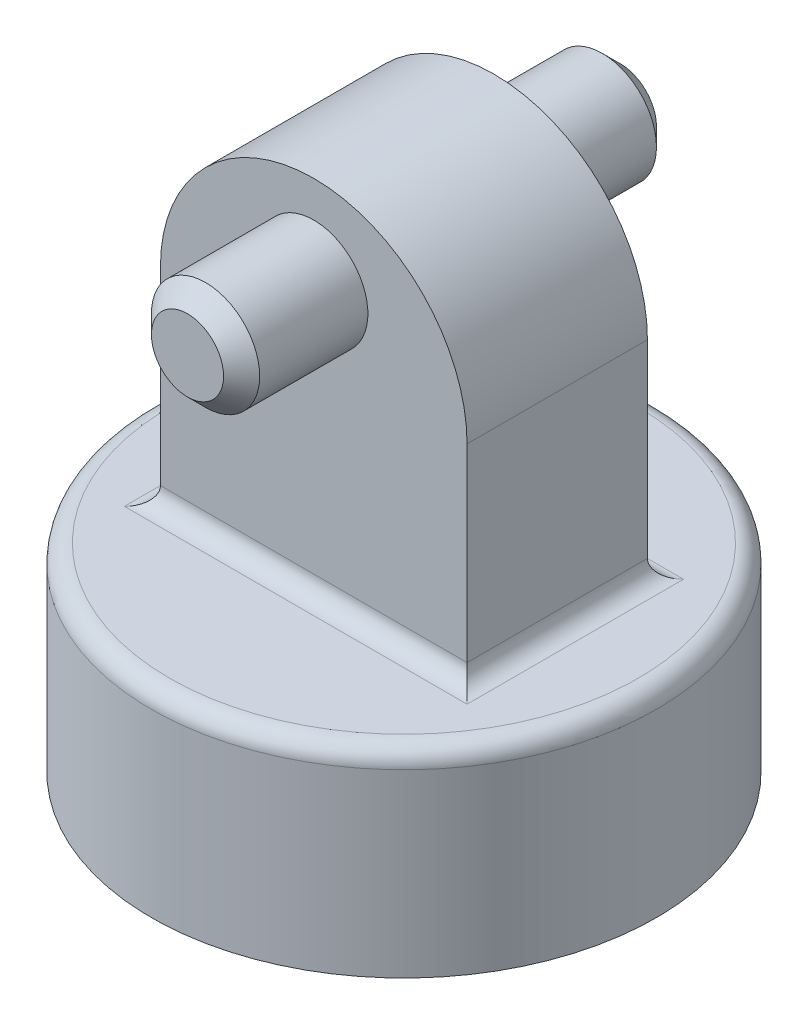
ISO-10303-21;
HEADER;
FILE_DESCRIPTION(('STEP AP214'),'2;1');
FILE_NAME('part.step','',(''),(''),'','','');
FILE_SCHEMA(('AUTOMOTIVE_DESIGN { 1 0 10303 214 1 1 1 1 }'));
ENDSEC;
DATA;
#1=APPLICATION_CONTEXT('core data for automotive mechanical design processes');
#2=APPLICATION_PROTOCOL_DEFINITION('international standard','automotive_design',2000,#1);
#3=PRODUCT_CONTEXT('',#1,'mechanical');
#4=PRODUCT('Part','Part','',(#3));
#5=PRODUCT_RELATED_PRODUCT_CATEGORY('part','',(#4));
#6=PRODUCT_DEFINITION_FORMATION('','',#4);
#7=PRODUCT_DEFINITION_CONTEXT('part definition',#1,'design');
#8=PRODUCT_DEFINITION('design','',#6,#7);
#9=PRODUCT_DEFINITION_SHAPE('','',#8);
#10=(LENGTH_UNIT() NAMED_UNIT(*) SI_UNIT(.MILLI.,.METRE.));
#11=(NAMED_UNIT(*) PLANE_ANGLE_UNIT() SI_UNIT($,.RADIAN.));
#12=(NAMED_UNIT(*) SI_UNIT($,.STERADIAN.) SOLID_ANGLE_UNIT());
#13=UNCERTAINTY_MEASURE_WITH_UNIT(LENGTH_MEASURE(1.E-05),#10,'distance_accuracy_value','');
#14=(GEOMETRIC_REPRESENTATION_CONTEXT(3) GLOBAL_UNCERTAINTY_ASSIGNED_CONTEXT((#13)) GLOBAL_UNIT_ASSIGNED_CONTEXT((#10,
#11,#12)) REPRESENTATION_CONTEXT('',''));
#15=CARTESIAN_POINT('',(0.,0.,0.));
#16=DIRECTION('',(0.,0.,1.));
#17=DIRECTION('',(1.,0.,0.));
#18=AXIS2_PLACEMENT_3D('',#15,#16,#17);
#19=CARTESIAN_POINT('',(-8.5,31.,-5.));
#20=DIRECTION('',(0.,0.,1.));
#21=DIRECTION('',(1.,0.,0.));
#22=AXIS2_PLACEMENT_3D('',#19,#20,#21);
#23=PLANE('',#22);
#24=CARTESIAN_POINT('',(0.,26.,-5.));
#25=DIRECTION('',(0.,0.,1.));
#26=DIRECTION('',(1.,0.,0.));
#27=AXIS2_PLACEMENT_3D('',#24,#25,#26);
#28=CIRCLE('',#27,3.);
#29=CARTESIAN_POINT('',(3.,26.,-5.));
#30=VERTEX_POINT('',#29);
#31=EDGE_CURVE('E123',#30,#30,#28,.T.);
#32=ORIENTED_EDGE('',*,*,#31,.T.);
#33=EDGE_LOOP('',(#32));
#34=FACE_BOUND('',#33,.T.);
#35=CARTESIAN_POINT('',(0.,22.5,-5.));
#36=DIRECTION('',(0.,0.,1.));
#37=DIRECTION('',(1.,0.,0.));
#38=AXIS2_PLACEMENT_3D('',#35,#36,#37);
#39=CIRCLE('',#38,8.5);
#40=CARTESIAN_POINT('',(8.5,22.5,-5.));
#41=VERTEX_POINT('',#40);
#42=CARTESIAN_POINT('',(-8.5,22.5,-5.));
#43=VERTEX_POINT('',#42);
#44=EDGE_CURVE('E135',#41,#43,#39,.T.);
#45=ORIENTED_EDGE('',*,*,#44,.F.);
#46=DIRECTION('',(0.,-1.,0.));
#47=VECTOR('',#46,1.);
#48=CARTESIAN_POINT('',(8.5,31.,-5.));
#49=LINE('',#48,#47);
#50=CARTESIAN_POINT('',(8.5,12.,-5.));
#51=VERTEX_POINT('',#50);
#52=EDGE_CURVE('E120',#41,#51,#49,.T.);
#53=ORIENTED_EDGE('',*,*,#52,.T.);
#54=DIRECTION('',(-1.,0.,0.));
#55=VECTOR('',#54,1.);
#56=CARTESIAN_POINT('',(-8.5,12.,-5.));
#57=LINE('',#56,#55);
#58=CARTESIAN_POINT('',(-8.5,12.,-5.));
#59=VERTEX_POINT('',#58);
#60=EDGE_CURVE('E154',#51,#59,#57,.T.);
#61=ORIENTED_EDGE('',*,*,#60,.T.);
#62=DIRECTION('',(0.,-1.,0.));
#63=VECTOR('',#62,1.);
#64=CARTESIAN_POINT('',(-8.5,31.,-5.));
#65=LINE('',#64,#63);
#66=EDGE_CURVE('E129',#43,#59,#65,.T.);
#67=ORIENTED_EDGE('',*,*,#66,.F.);
#68=EDGE_LOOP('',(#45,#53,#61,#67));
#69=FACE_BOUND('',#68,.T.);
#70=ADVANCED_FACE('F60',(#34,#69),#23,.F.);
#71=CARTESIAN_POINT('',(-8.5,31.,5.));
#72=DIRECTION('',(0.,0.,-1.));
#73=DIRECTION('',(-1.,0.,0.));
#74=AXIS2_PLACEMENT_3D('',#71,#72,#73);
#75=PLANE('',#74);
#76=CARTESIAN_POINT('',(0.,26.,5.));
#77=DIRECTION('',(0.,0.,-1.));
#78=DIRECTION('',(-1.,0.,0.));
#79=AXIS2_PLACEMENT_3D('',#76,#77,#78);
#80=CIRCLE('',#79,3.);
#81=CARTESIAN_POINT('',(-3.,26.,5.));
#82=VERTEX_POINT('',#81);
#83=EDGE_CURVE('E172',#82,#82,#80,.F.);
#84=ORIENTED_EDGE('',*,*,#83,.F.);
#85=EDGE_LOOP('',(#84));
#86=FACE_BOUND('',#85,.T.);
#87=DIRECTION('',(0.,-1.,0.));
#88=VECTOR('',#87,1.);
#89=CARTESIAN_POINT('',(8.5,31.,5.));
#90=LINE('',#89,#88);
#91=CARTESIAN_POINT('',(8.5,22.5,5.));
#92=VERTEX_POINT('',#91);
#93=CARTESIAN_POINT('',(8.5,12.,5.));
#94=VERTEX_POINT('',#93);
#95=EDGE_CURVE('E75',#92,#94,#90,.T.);
#96=ORIENTED_EDGE('',*,*,#95,.F.);
#97=CARTESIAN_POINT('',(0.,22.5,5.));
#98=DIRECTION('',(0.,0.,1.));
#99=DIRECTION('',(1.,0.,0.));
#100=AXIS2_PLACEMENT_3D('',#97,#98,#99);
#101=CIRCLE('',#100,8.5);
#102=CARTESIAN_POINT('',(-8.5,22.5,5.));
#103=VERTEX_POINT('',#102);
#104=EDGE_CURVE('E115',#103,#92,#101,.F.);
#105=ORIENTED_EDGE('',*,*,#104,.F.);
#106=DIRECTION('',(0.,-1.,0.));
#107=VECTOR('',#106,1.);
#108=CARTESIAN_POINT('',(-8.5,31.,5.));
#109=LINE('',#108,#107);
#110=CARTESIAN_POINT('',(-8.5,12.,5.));
#111=VERTEX_POINT('',#110);
#112=EDGE_CURVE('E78',#103,#111,#109,.T.);
#113=ORIENTED_EDGE('',*,*,#112,.T.);
#114=DIRECTION('',(1.,0.,0.));
#115=VECTOR('',#114,1.);
#116=CARTESIAN_POINT('',(8.5,12.,5.));
#117=LINE('',#116,#115);
#118=EDGE_CURVE('E124',#111,#94,#117,.T.);
#119=ORIENTED_EDGE('',*,*,#118,.T.);
#120=EDGE_LOOP('',(#96,#105,#113,#119));
#121=FACE_BOUND('',#120,.T.);
#122=ADVANCED_FACE('F121',(#86,#121),#75,.F.);
#123=CARTESIAN_POINT('',(8.5,31.,5.));
#124=DIRECTION('',(-1.,0.,0.));
#125=DIRECTION('',(0.,0.,1.));
#126=AXIS2_PLACEMENT_3D('',#123,#124,#125);
#127=PLANE('',#126);
#128=DIRECTION('',(0.,0.,1.));
#129=VECTOR('',#128,1.);
#130=CARTESIAN_POINT('',(8.5,22.5,-14.001));
#131=LINE('',#130,#129);
#132=EDGE_CURVE('E111',#41,#92,#131,.T.);
#133=ORIENTED_EDGE('',*,*,#132,.T.);
#134=ORIENTED_EDGE('',*,*,#95,.T.);
#135=DIRECTION('',(0.,0.,-1.));
#136=VECTOR('',#135,1.);
#137=CARTESIAN_POINT('',(8.5,12.,-5.));
#138=LINE('',#137,#136);
#139=EDGE_CURVE('E168',#94,#51,#138,.T.);
#140=ORIENTED_EDGE('',*,*,#139,.T.);
#141=ORIENTED_EDGE('',*,*,#52,.F.);
#142=EDGE_LOOP('',(#133,#134,#140,#141));
#143=FACE_BOUND('',#142,.T.);
#144=ADVANCED_FACE('F118',(#143),#127,.F.);
#145=CARTESIAN_POINT('',(-14.,11.,0.));
#146=DIRECTION('',(0.,-1.,0.));
#147=DIRECTION('',(0.,0.,-1.));
#148=AXIS2_PLACEMENT_3D('',#145,#146,#147);
#149=PLANE('',#148);
#150=DIRECTION('',(0.,0.,1.));
#151=VECTOR('',#150,1.);
#152=CARTESIAN_POINT('',(-9.5,11.,-5.));
#153=LINE('',#152,#151);
#154=CARTESIAN_POINT('',(-9.5,11.,6.));
#155=VERTEX_POINT('',#154);
#156=CARTESIAN_POINT('',(-9.5,11.,-6.));
#157=VERTEX_POINT('',#156);
#158=EDGE_CURVE('E165',#155,#157,#153,.F.);
#159=ORIENTED_EDGE('',*,*,#158,.T.);
#160=DIRECTION('',(-1.,0.,0.));
#161=VECTOR('',#160,1.);
#162=CARTESIAN_POINT('',(8.5,11.,-6.));
#163=LINE('',#162,#161);
#164=CARTESIAN_POINT('',(9.5,11.,-6.));
#165=VERTEX_POINT('',#164);
#166=EDGE_CURVE('E163',#157,#165,#163,.F.);
#167=ORIENTED_EDGE('',*,*,#166,.T.);
#168=DIRECTION('',(0.,0.,-1.));
#169=VECTOR('',#168,1.);
#170=CARTESIAN_POINT('',(9.5,11.,5.));
#171=LINE('',#170,#169);
#172=CARTESIAN_POINT('',(9.5,11.,6.));
#173=VERTEX_POINT('',#172);
#174=EDGE_CURVE('E158',#165,#173,#171,.F.);
#175=ORIENTED_EDGE('',*,*,#174,.T.);
#176=DIRECTION('',(1.,0.,0.));
#177=VECTOR('',#176,1.);
#178=CARTESIAN_POINT('',(-8.5,11.,6.));
#179=LINE('',#178,#177);
#180=EDGE_CURVE('E159',#173,#155,#179,.F.);
#181=ORIENTED_EDGE('',*,*,#180,.T.);
#182=EDGE_LOOP('',(#159,#167,#175,#181));
#183=FACE_BOUND('',#182,.T.);
#184=CARTESIAN_POINT('',(0.,11.,0.));
#185=DIRECTION('',(0.,-1.,0.));
#186=DIRECTION('',(0.,0.,-1.));
#187=AXIS2_PLACEMENT_3D('',#184,#185,#186);
#188=CIRCLE('',#187,13.);
#189=CARTESIAN_POINT('',(0.,11.,-13.));
#190=VERTEX_POINT('',#189);
#191=EDGE_CURVE('E155',#190,#190,#188,.F.);
#192=ORIENTED_EDGE('',*,*,#191,.T.);
#193=EDGE_LOOP('',(#192));
#194=FACE_BOUND('',#193,.T.);
#195=ADVANCED_FACE('F218',(#183,#194),#149,.F.);
#196=CARTESIAN_POINT('',(0.,0.,0.));
#197=DIRECTION('',(0.,-1.,0.));
#198=DIRECTION('',(0.,0.,-1.));
#199=AXIS2_PLACEMENT_3D('',#196,#197,#198);
#200=CYLINDRICAL_SURFACE('',#199,14.);
#201=CARTESIAN_POINT('',(0.,10.,0.));
#202=DIRECTION('',(0.,-1.,0.));
#203=DIRECTION('',(0.,0.,-1.));
#204=AXIS2_PLACEMENT_3D('',#201,#202,#203);
#205=CIRCLE('',#204,14.);
#206=CARTESIAN_POINT('',(0.,10.,-14.));
#207=VERTEX_POINT('',#206);
#208=EDGE_CURVE('E149',#207,#207,#205,.T.);
#209=ORIENTED_EDGE('',*,*,#208,.T.);
#210=EDGE_LOOP('',(#209));
#211=FACE_BOUND('',#210,.T.);
#212=CARTESIAN_POINT('',(0.,0.,0.));
#213=DIRECTION('',(0.,-1.,0.));
#214=DIRECTION('',(0.,0.,-1.));
#215=AXIS2_PLACEMENT_3D('',#212,#213,#214);
#216=CIRCLE('',#215,14.);
#217=CARTESIAN_POINT('',(0.,0.,-14.));
#218=VERTEX_POINT('',#217);
#219=EDGE_CURVE('E148',#218,#218,#216,.T.);
#220=ORIENTED_EDGE('',*,*,#219,.F.);
#221=EDGE_LOOP('',(#220));
#222=FACE_BOUND('',#221,.T.);
#223=ADVANCED_FACE('F235',(#211,#222),#200,.T.);
#224=CARTESIAN_POINT('',(-12.,0.,0.));
#225=DIRECTION('',(0.,1.,0.));
#226=DIRECTION('',(0.,0.,1.));
#227=AXIS2_PLACEMENT_3D('',#224,#225,#226);
#228=PLANE('',#227);
#229=CARTESIAN_POINT('',(0.,0.,0.));
#230=DIRECTION('',(0.,-1.,0.));
#231=DIRECTION('',(0.,0.,-1.));
#232=AXIS2_PLACEMENT_3D('',#229,#230,#231);
#233=CIRCLE('',#232,12.);
#234=CARTESIAN_POINT('',(0.,0.,-12.));
#235=VERTEX_POINT('',#234);
#236=EDGE_CURVE('E141',#235,#235,#233,.T.);
#237=ORIENTED_EDGE('',*,*,#236,.F.);
#238=EDGE_LOOP('',(#237));
#239=FACE_BOUND('',#238,.T.);
#240=ORIENTED_EDGE('',*,*,#219,.T.);
#241=EDGE_LOOP('',(#240));
#242=FACE_BOUND('',#241,.T.);
#243=ADVANCED_FACE('F229',(#239,#242),#228,.F.);
#244=CARTESIAN_POINT('',(0.,0.,0.));
#245=DIRECTION('',(0.,-1.,0.));
#246=DIRECTION('',(0.,0.,-1.));
#247=AXIS2_PLACEMENT_3D('',#244,#245,#246);
#248=CYLINDRICAL_SURFACE('',#247,12.);
#249=CARTESIAN_POINT('',(0.,9.,0.));
#250=DIRECTION('',(0.,-1.,0.));
#251=DIRECTION('',(0.,0.,-1.));
#252=AXIS2_PLACEMENT_3D('',#249,#250,#251);
#253=CIRCLE('',#252,12.);
#254=CARTESIAN_POINT('',(0.,9.,-12.));
#255=VERTEX_POINT('',#254);
#256=EDGE_CURVE('E139',#255,#255,#253,.T.);
#257=ORIENTED_EDGE('',*,*,#256,.F.);
#258=EDGE_LOOP('',(#257));
#259=FACE_BOUND('',#258,.T.);
#260=ORIENTED_EDGE('',*,*,#236,.T.);
#261=EDGE_LOOP('',(#260));
#262=FACE_BOUND('',#261,.T.);
#263=ADVANCED_FACE('F221',(#259,#262),#248,.F.);
#264=CARTESIAN_POINT('',(-12.,9.,0.));
#265=DIRECTION('',(0.,1.,0.));
#266=DIRECTION('',(0.,0.,1.));
#267=AXIS2_PLACEMENT_3D('',#264,#265,#266);
#268=PLANE('',#267);
#269=ORIENTED_EDGE('',*,*,#256,.T.);
#270=EDGE_LOOP('',(#269));
#271=FACE_BOUND('',#270,.T.);
#272=ADVANCED_FACE('F219',(#271),#268,.F.);
#273=CARTESIAN_POINT('',(0.,10.,0.));
#274=DIRECTION('',(0.,-1.,0.));
#275=DIRECTION('',(0.,0.,-1.));
#276=AXIS2_PLACEMENT_3D('',#273,#274,#275);
#277=TOROIDAL_SURFACE('',#276,13.,1.);
#278=ORIENTED_EDGE('',*,*,#191,.F.);
#279=EDGE_LOOP('',(#278));
#280=FACE_BOUND('',#279,.T.);
#281=ORIENTED_EDGE('',*,*,#208,.F.);
#282=EDGE_LOOP('',(#281));
#283=FACE_BOUND('',#282,.T.);
#284=ADVANCED_FACE('F224',(#280,#283),#277,.T.);
#285=CARTESIAN_POINT('',(-8.5,31.,5.));
#286=DIRECTION('',(1.,0.,0.));
#287=DIRECTION('',(0.,0.,-1.));
#288=AXIS2_PLACEMENT_3D('',#285,#286,#287);
#289=PLANE('',#288);
#290=ORIENTED_EDGE('',*,*,#112,.F.);
#291=DIRECTION('',(0.,0.,1.));
#292=VECTOR('',#291,1.);
#293=CARTESIAN_POINT('',(-8.5,22.5,-14.001));
#294=LINE('',#293,#292);
#295=EDGE_CURVE('E117',#43,#103,#294,.T.);
#296=ORIENTED_EDGE('',*,*,#295,.F.);
#297=ORIENTED_EDGE('',*,*,#66,.T.);
#298=DIRECTION('',(0.,0.,1.));
#299=VECTOR('',#298,1.);
#300=CARTESIAN_POINT('',(-8.5,12.,5.));
#301=LINE('',#300,#299);
#302=EDGE_CURVE('E170',#59,#111,#301,.T.);
#303=ORIENTED_EDGE('',*,*,#302,.T.);
#304=EDGE_LOOP('',(#290,#296,#297,#303));
#305=FACE_BOUND('',#304,.T.);
#306=ADVANCED_FACE('F216',(#305),#289,.F.);
#307=CARTESIAN_POINT('',(-8.5,12.,6.));
#308=DIRECTION('',(-1.,0.,0.));
#309=DIRECTION('',(0.,0.,1.));
#310=AXIS2_PLACEMENT_3D('',#307,#308,#309);
#311=CYLINDRICAL_SURFACE('',#310,1.);
#312=CARTESIAN_POINT('',(-9.5,12.,6.));
#313=DIRECTION('',(-0.707106781186547,0.,-0.707106781186547));
#314=DIRECTION('',(-0.707106781186547,0.,0.707106781186547));
#315=AXIS2_PLACEMENT_3D('',#312,#313,#314);
#316=ELLIPSE('',#315,1.41421356237309,1.);
#317=EDGE_CURVE('E132',#155,#111,#316,.F.);
#318=ORIENTED_EDGE('',*,*,#317,.F.);
#319=ORIENTED_EDGE('',*,*,#180,.F.);
#320=CARTESIAN_POINT('',(9.5,12.,6.));
#321=DIRECTION('',(-0.707106781186547,0.,0.707106781186547));
#322=DIRECTION('',(0.707106781186547,0.,0.707106781186547));
#323=AXIS2_PLACEMENT_3D('',#320,#321,#322);
#324=ELLIPSE('',#323,1.41421356237309,1.);
#325=EDGE_CURVE('E130',#94,#173,#324,.T.);
#326=ORIENTED_EDGE('',*,*,#325,.F.);
#327=ORIENTED_EDGE('',*,*,#118,.F.);
#328=EDGE_LOOP('',(#318,#319,#326,#327));
#329=FACE_BOUND('',#328,.T.);
#330=ADVANCED_FACE('F255',(#329),#311,.F.);
#331=CARTESIAN_POINT('',(9.5,12.,5.));
#332=DIRECTION('',(0.,0.,1.));
#333=DIRECTION('',(1.,0.,0.));
#334=AXIS2_PLACEMENT_3D('',#331,#332,#333);
#335=CYLINDRICAL_SURFACE('',#334,1.);
#336=ORIENTED_EDGE('',*,*,#325,.T.);
#337=ORIENTED_EDGE('',*,*,#174,.F.);
#338=CARTESIAN_POINT('',(9.5,12.,-6.));
#339=DIRECTION('',(0.707106781186547,0.,0.707106781186547));
#340=DIRECTION('',(-0.707106781186547,0.,0.707106781186547));
#341=AXIS2_PLACEMENT_3D('',#338,#339,#340);
#342=ELLIPSE('',#341,1.41421356237309,1.);
#343=EDGE_CURVE('E178',#51,#165,#342,.T.);
#344=ORIENTED_EDGE('',*,*,#343,.F.);
#345=ORIENTED_EDGE('',*,*,#139,.F.);
#346=EDGE_LOOP('',(#336,#337,#344,#345));
#347=FACE_BOUND('',#346,.T.);
#348=ADVANCED_FACE('F249',(#347),#335,.F.);
#349=CARTESIAN_POINT('',(-9.5,12.,5.));
#350=DIRECTION('',(0.,0.,-1.));
#351=DIRECTION('',(-1.,0.,0.));
#352=AXIS2_PLACEMENT_3D('',#349,#350,#351);
#353=CYLINDRICAL_SURFACE('',#352,1.);
#354=ORIENTED_EDGE('',*,*,#317,.T.);
#355=ORIENTED_EDGE('',*,*,#302,.F.);
#356=CARTESIAN_POINT('',(-9.5,12.,-6.));
#357=DIRECTION('',(0.707106781186547,0.,-0.707106781186547));
#358=DIRECTION('',(-0.707106781186547,0.,-0.707106781186547));
#359=AXIS2_PLACEMENT_3D('',#356,#357,#358);
#360=ELLIPSE('',#359,1.41421356237309,1.);
#361=EDGE_CURVE('E174',#157,#59,#360,.F.);
#362=ORIENTED_EDGE('',*,*,#361,.F.);
#363=ORIENTED_EDGE('',*,*,#158,.F.);
#364=EDGE_LOOP('',(#354,#355,#362,#363));
#365=FACE_BOUND('',#364,.T.);
#366=ADVANCED_FACE('F248',(#365),#353,.F.);
#367=CARTESIAN_POINT('',(-8.5,12.,-6.));
#368=DIRECTION('',(1.,0.,0.));
#369=DIRECTION('',(0.,0.,-1.));
#370=AXIS2_PLACEMENT_3D('',#367,#368,#369);
#371=CYLINDRICAL_SURFACE('',#370,1.);
#372=ORIENTED_EDGE('',*,*,#343,.T.);
#373=ORIENTED_EDGE('',*,*,#166,.F.);
#374=ORIENTED_EDGE('',*,*,#361,.T.);
#375=ORIENTED_EDGE('',*,*,#60,.F.);
#376=EDGE_LOOP('',(#372,#373,#374,#375));
#377=FACE_BOUND('',#376,.T.);
#378=ADVANCED_FACE('F244',(#377),#371,.F.);
#379=CARTESIAN_POINT('',(0.,22.5,-14.001));
#380=DIRECTION('',(0.,0.,1.));
#381=DIRECTION('',(1.,0.,0.));
#382=AXIS2_PLACEMENT_3D('',#379,#380,#381);
#383=CYLINDRICAL_SURFACE('',#382,8.5);
#384=ORIENTED_EDGE('',*,*,#44,.T.);
#385=ORIENTED_EDGE('',*,*,#295,.T.);
#386=ORIENTED_EDGE('',*,*,#104,.T.);
#387=ORIENTED_EDGE('',*,*,#132,.F.);
#388=EDGE_LOOP('',(#384,#385,#386,#387));
#389=FACE_BOUND('',#388,.T.);
#390=ADVANCED_FACE('F114',(#389),#383,.T.);
#391=CARTESIAN_POINT('',(0.,26.,12.));
#392=DIRECTION('',(0.,0.,-1.));
#393=DIRECTION('',(-1.,0.,0.));
#394=AXIS2_PLACEMENT_3D('',#391,#392,#393);
#395=CYLINDRICAL_SURFACE('',#394,3.);
#396=CARTESIAN_POINT('',(0.,26.,11.));
#397=DIRECTION('',(0.,0.,1.));
#398=DIRECTION('',(1.,0.,0.));
#399=AXIS2_PLACEMENT_3D('',#396,#397,#398);
#400=CIRCLE('',#399,3.);
#401=CARTESIAN_POINT('',(3.,26.,11.));
#402=VERTEX_POINT('',#401);
#403=EDGE_CURVE('E183',#402,#402,#400,.F.);
#404=ORIENTED_EDGE('',*,*,#403,.T.);
#405=EDGE_LOOP('',(#404));
#406=FACE_BOUND('',#405,.T.);
#407=ORIENTED_EDGE('',*,*,#83,.T.);
#408=EDGE_LOOP('',(#407));
#409=FACE_BOUND('',#408,.T.);
#410=ADVANCED_FACE('F264',(#406,#409),#395,.T.);
#411=CARTESIAN_POINT('',(0.,26.,12.));
#412=DIRECTION('',(0.,0.,1.));
#413=DIRECTION('',(1.,0.,0.));
#414=AXIS2_PLACEMENT_3D('',#411,#412,#413);
#415=PLANE('',#414);
#416=CARTESIAN_POINT('',(0.,26.,12.));
#417=DIRECTION('',(0.,0.,1.));
#418=DIRECTION('',(1.,0.,0.));
#419=AXIS2_PLACEMENT_3D('',#416,#417,#418);
#420=CIRCLE('',#419,2.);
#421=CARTESIAN_POINT('',(2.,26.,12.));
#422=VERTEX_POINT('',#421);
#423=EDGE_CURVE('E185',#422,#422,#420,.T.);
#424=ORIENTED_EDGE('',*,*,#423,.T.);
#425=EDGE_LOOP('',(#424));
#426=FACE_BOUND('',#425,.T.);
#427=ADVANCED_FACE('F259',(#426),#415,.T.);
#428=CARTESIAN_POINT('',(0.,26.,12.));
#429=DIRECTION('',(0.,0.,-1.));
#430=DIRECTION('',(-1.,0.,0.));
#431=AXIS2_PLACEMENT_3D('',#428,#429,#430);
#432=CONICAL_SURFACE('',#431,2.,0.785398163397446);
#433=ORIENTED_EDGE('',*,*,#403,.F.);
#434=EDGE_LOOP('',(#433));
#435=FACE_BOUND('',#434,.T.);
#436=ORIENTED_EDGE('',*,*,#423,.F.);
#437=EDGE_LOOP('',(#436));
#438=FACE_BOUND('',#437,.T.);
#439=ADVANCED_FACE('F256',(#435,#438),#432,.T.);
#440=CARTESIAN_POINT('',(0.,26.,-12.));
#441=DIRECTION('',(0.,0.,1.));
#442=DIRECTION('',(1.,0.,0.));
#443=AXIS2_PLACEMENT_3D('',#440,#441,#442);
#444=CYLINDRICAL_SURFACE('',#443,3.);
#445=CARTESIAN_POINT('',(0.,26.,-11.));
#446=DIRECTION('',(0.,0.,-1.));
#447=DIRECTION('',(-1.,0.,0.));
#448=AXIS2_PLACEMENT_3D('',#445,#446,#447);
#449=CIRCLE('',#448,3.);
#450=CARTESIAN_POINT('',(-3.,26.,-11.));
#451=VERTEX_POINT('',#450);
#452=EDGE_CURVE('E65',#451,#451,#449,.F.);
#453=ORIENTED_EDGE('',*,*,#452,.T.);
#454=EDGE_LOOP('',(#453));
#455=FACE_BOUND('',#454,.T.);
#456=ORIENTED_EDGE('',*,*,#31,.F.);
#457=EDGE_LOOP('',(#456));
#458=FACE_BOUND('',#457,.T.);
#459=ADVANCED_FACE('F190',(#455,#458),#444,.T.);
#460=CARTESIAN_POINT('',(0.,26.,-12.));
#461=DIRECTION('',(0.,0.,-1.));
#462=DIRECTION('',(1.,0.,0.));
#463=AXIS2_PLACEMENT_3D('',#460,#461,#462);
#464=PLANE('',#463);
#465=CARTESIAN_POINT('',(0.,26.,-12.));
#466=DIRECTION('',(0.,0.,-1.));
#467=DIRECTION('',(-1.,0.,0.));
#468=AXIS2_PLACEMENT_3D('',#465,#466,#467);
#469=CIRCLE('',#468,1.99999999999999);
#470=CARTESIAN_POINT('',(-2.,26.,-12.));
#471=VERTEX_POINT('',#470);
#472=EDGE_CURVE('E12',#471,#471,#469,.T.);
#473=ORIENTED_EDGE('',*,*,#472,.T.);
#474=EDGE_LOOP('',(#473));
#475=FACE_BOUND('',#474,.T.);
#476=ADVANCED_FACE('F192',(#475),#464,.T.);
#477=CARTESIAN_POINT('',(0.,26.,-11.));
#478=DIRECTION('',(0.,0.,1.));
#479=DIRECTION('',(1.,0.,0.));
#480=AXIS2_PLACEMENT_3D('',#477,#478,#479);
#481=CONICAL_SURFACE('',#480,3.,0.78539816339745);
#482=ORIENTED_EDGE('',*,*,#472,.F.);
#483=EDGE_LOOP('',(#482));
#484=FACE_BOUND('',#483,.T.);
#485=ORIENTED_EDGE('',*,*,#452,.F.);
#486=EDGE_LOOP('',(#485));
#487=FACE_BOUND('',#486,.T.);
#488=ADVANCED_FACE('F56',(#484,#487),#481,.T.);
#489=CLOSED_SHELL('',(#70,#122,#144,#195,#223,#243,#263,#272,#284,#306,#330,#348,#366,#378,#390,
#410,#427,#439,#459,#476,#488));
#490=MANIFOLD_SOLID_BREP('B2',#489);
#491=ADVANCED_BREP_SHAPE_REPRESENTATION('',(#18,#490),#14);
#492=SHAPE_DEFINITION_REPRESENTATION(#9,#491);
ENDSEC;
END-ISO-10303-21;
